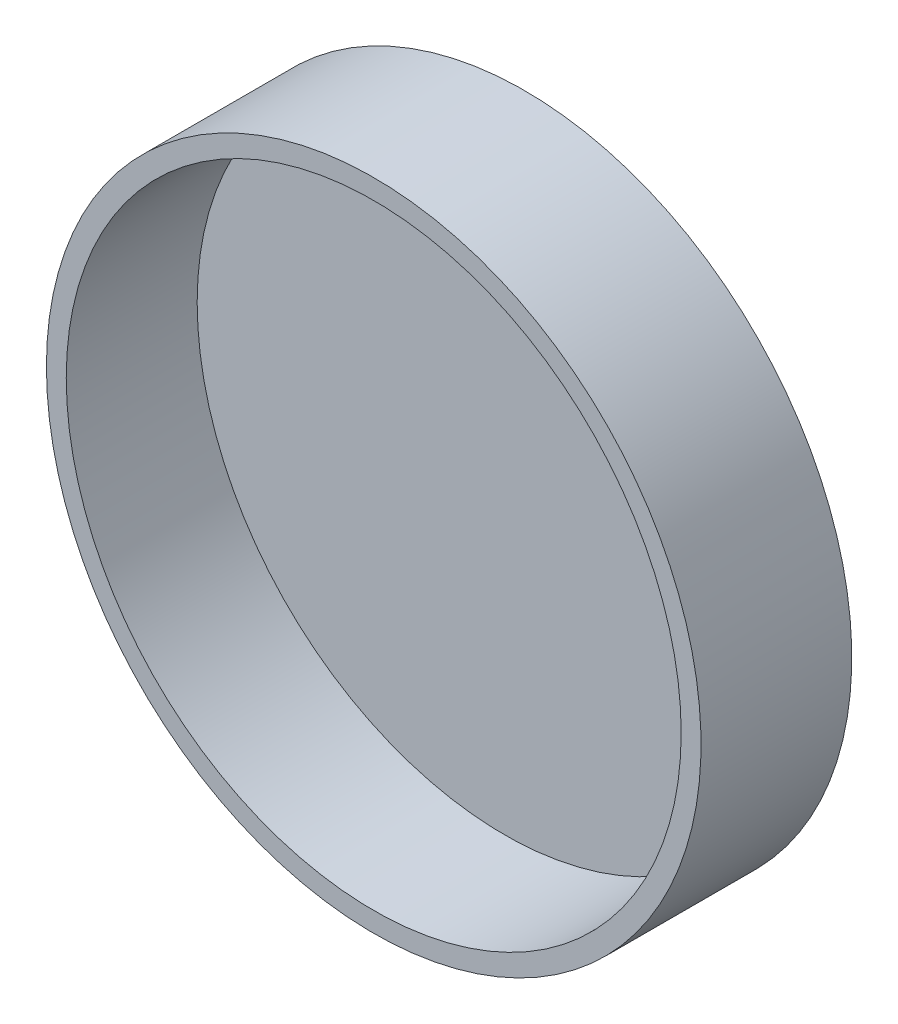
ISO-10303-21;
HEADER;
FILE_DESCRIPTION(('STEP AP214'),'2;1');
FILE_NAME('part.step','',(''),(''),'','','');
FILE_SCHEMA(('AUTOMOTIVE_DESIGN { 1 0 10303 214 1 1 1 1 }'));
ENDSEC;
DATA;
#1=APPLICATION_CONTEXT('core data for automotive mechanical design processes');
#2=APPLICATION_PROTOCOL_DEFINITION('international standard','automotive_design',2000,#1);
#3=PRODUCT_CONTEXT('',#1,'mechanical');
#4=PRODUCT('Part','Part','',(#3));
#5=PRODUCT_RELATED_PRODUCT_CATEGORY('part','',(#4));
#6=PRODUCT_DEFINITION_FORMATION('','',#4);
#7=PRODUCT_DEFINITION_CONTEXT('part definition',#1,'design');
#8=PRODUCT_DEFINITION('design','',#6,#7);
#9=PRODUCT_DEFINITION_SHAPE('','',#8);
#10=(LENGTH_UNIT() NAMED_UNIT(*) SI_UNIT(.MILLI.,.METRE.));
#11=(NAMED_UNIT(*) PLANE_ANGLE_UNIT() SI_UNIT($,.RADIAN.));
#12=(NAMED_UNIT(*) SI_UNIT($,.STERADIAN.) SOLID_ANGLE_UNIT());
#13=UNCERTAINTY_MEASURE_WITH_UNIT(LENGTH_MEASURE(1.E-05),#10,'distance_accuracy_value','');
#14=(GEOMETRIC_REPRESENTATION_CONTEXT(3) GLOBAL_UNCERTAINTY_ASSIGNED_CONTEXT((#13)) GLOBAL_UNIT_ASSIGNED_CONTEXT((#10,
#11,#12)) REPRESENTATION_CONTEXT('',''));
#15=CARTESIAN_POINT('',(0.,0.,0.));
#16=DIRECTION('',(0.,0.,1.));
#17=DIRECTION('',(1.,0.,0.));
#18=AXIS2_PLACEMENT_3D('',#15,#16,#17);
#19=CARTESIAN_POINT('',(0.,0.,7.6));
#20=DIRECTION('',(0.,0.,-1.));
#21=DIRECTION('',(-1.,0.,0.));
#22=AXIS2_PLACEMENT_3D('',#19,#20,#21);
#23=CYLINDRICAL_SURFACE('',#22,16.5);
#24=CARTESIAN_POINT('',(0.,0.,7.6));
#25=DIRECTION('',(0.,0.,1.));
#26=DIRECTION('',(1.,0.,0.));
#27=AXIS2_PLACEMENT_3D('',#24,#25,#26);
#28=CIRCLE('',#27,16.5);
#29=CARTESIAN_POINT('',(-16.5,0.,7.6));
#30=VERTEX_POINT('',#29);
#31=EDGE_CURVE('E10',#30,#30,#28,.T.);
#32=CARTESIAN_POINT('',(0.,0.,0.));
#33=DIRECTION('',(0.,0.,1.));
#34=DIRECTION('',(1.,0.,0.));
#35=AXIS2_PLACEMENT_3D('',#32,#33,#34);
#36=CIRCLE('',#35,16.5);
#37=CARTESIAN_POINT('',(-16.5,0.,0.));
#38=VERTEX_POINT('',#37);
#39=EDGE_CURVE('E34',#38,#38,#36,.T.);
#40=CARTESIAN_POINT('',(-16.5,0.,7.6));
#41=CARTESIAN_POINT('',(-16.5,0.,7.52083333333333));
#42=CARTESIAN_POINT('',(-16.5,0.,7.44166666666667));
#43=CARTESIAN_POINT('',(-16.5,0.,7.28333333333333));
#44=CARTESIAN_POINT('',(-16.5,0.,7.20416666666667));
#45=CARTESIAN_POINT('',(-16.5,0.,7.04583333333333));
#46=CARTESIAN_POINT('',(-16.5,0.,6.96666666666667));
#47=CARTESIAN_POINT('',(-16.5,0.,6.80833333333333));
#48=CARTESIAN_POINT('',(-16.5,0.,6.72916666666667));
#49=CARTESIAN_POINT('',(-16.5,0.,6.57083333333333));
#50=CARTESIAN_POINT('',(-16.5,0.,6.49166666666667));
#51=CARTESIAN_POINT('',(-16.5,0.,6.33333333333333));
#52=CARTESIAN_POINT('',(-16.5,0.,6.25416666666667));
#53=CARTESIAN_POINT('',(-16.5,0.,6.09583333333333));
#54=CARTESIAN_POINT('',(-16.5,0.,6.01666666666667));
#55=CARTESIAN_POINT('',(-16.5,0.,5.85833333333333));
#56=CARTESIAN_POINT('',(-16.5,0.,5.77916666666667));
#57=CARTESIAN_POINT('',(-16.5,0.,5.62083333333333));
#58=CARTESIAN_POINT('',(-16.5,0.,5.54166666666667));
#59=CARTESIAN_POINT('',(-16.5,0.,5.38333333333333));
#60=CARTESIAN_POINT('',(-16.5,0.,5.30416666666667));
#61=CARTESIAN_POINT('',(-16.5,0.,5.14583333333333));
#62=CARTESIAN_POINT('',(-16.5,0.,5.06666666666667));
#63=CARTESIAN_POINT('',(-16.5,0.,4.90833333333333));
#64=CARTESIAN_POINT('',(-16.5,0.,4.82916666666667));
#65=CARTESIAN_POINT('',(-16.5,0.,4.67083333333333));
#66=CARTESIAN_POINT('',(-16.5,0.,4.59166666666667));
#67=CARTESIAN_POINT('',(-16.5,0.,4.43333333333333));
#68=CARTESIAN_POINT('',(-16.5,0.,4.35416666666667));
#69=CARTESIAN_POINT('',(-16.5,0.,4.19583333333333));
#70=CARTESIAN_POINT('',(-16.5,0.,4.11666666666667));
#71=CARTESIAN_POINT('',(-16.5,0.,3.95833333333333));
#72=CARTESIAN_POINT('',(-16.5,0.,3.87916666666667));
#73=CARTESIAN_POINT('',(-16.5,0.,3.72083333333333));
#74=CARTESIAN_POINT('',(-16.5,0.,3.64166666666667));
#75=CARTESIAN_POINT('',(-16.5,0.,3.48333333333333));
#76=CARTESIAN_POINT('',(-16.5,0.,3.40416666666667));
#77=CARTESIAN_POINT('',(-16.5,0.,3.24583333333333));
#78=CARTESIAN_POINT('',(-16.5,0.,3.16666666666667));
#79=CARTESIAN_POINT('',(-16.5,0.,3.00833333333333));
#80=CARTESIAN_POINT('',(-16.5,0.,2.92916666666667));
#81=CARTESIAN_POINT('',(-16.5,0.,2.77083333333333));
#82=CARTESIAN_POINT('',(-16.5,0.,2.69166666666667));
#83=CARTESIAN_POINT('',(-16.5,0.,2.53333333333333));
#84=CARTESIAN_POINT('',(-16.5,0.,2.45416666666667));
#85=CARTESIAN_POINT('',(-16.5,0.,2.29583333333333));
#86=CARTESIAN_POINT('',(-16.5,0.,2.21666666666667));
#87=CARTESIAN_POINT('',(-16.5,0.,2.05833333333333));
#88=CARTESIAN_POINT('',(-16.5,0.,1.97916666666667));
#89=CARTESIAN_POINT('',(-16.5,0.,1.82083333333333));
#90=CARTESIAN_POINT('',(-16.5,0.,1.74166666666667));
#91=CARTESIAN_POINT('',(-16.5,0.,1.58333333333333));
#92=CARTESIAN_POINT('',(-16.5,0.,1.50416666666667));
#93=CARTESIAN_POINT('',(-16.5,0.,1.34583333333333));
#94=CARTESIAN_POINT('',(-16.5,0.,1.26666666666667));
#95=CARTESIAN_POINT('',(-16.5,0.,1.10833333333333));
#96=CARTESIAN_POINT('',(-16.5,0.,1.02916666666667));
#97=CARTESIAN_POINT('',(-16.5,0.,0.870833333333333));
#98=CARTESIAN_POINT('',(-16.5,0.,0.791666666666667));
#99=CARTESIAN_POINT('',(-16.5,0.,0.633333333333333));
#100=CARTESIAN_POINT('',(-16.5,0.,0.554166666666666));
#101=CARTESIAN_POINT('',(-16.5,0.,0.395833333333333));
#102=CARTESIAN_POINT('',(-16.5,0.,0.316666666666667));
#103=CARTESIAN_POINT('',(-16.5,0.,0.158333333333333));
#104=CARTESIAN_POINT('',(-16.5,0.,0.0791666666666665));
#105=CARTESIAN_POINT('',(-16.5,0.,0.));
#106=B_SPLINE_CURVE_WITH_KNOTS('',3,(#40,#41,#42,#43,#44,#45,#46,#47,#48,#49,#50,#51,#52,#53,
#54,#55,#56,#57,#58,#59,#60,#61,#62,#63,#64,#65,#66,#67,#68,#69,#70,#71,#72,#73,#74,#75,#76,#77,
#78,#79,#80,#81,#82,#83,#84,#85,#86,#87,#88,#89,#90,#91,#92,#93,#94,#95,#96,#97,#98,#99,#100,
#101,#102,#103,#104,#105),.UNSPECIFIED.,.F.,.F.,(4,2,2,2,2,2,2,2,2,2,2,2,2,2,2,2,2,2,2,2,2,2,2,
2,2,2,2,2,2,2,2,2,4),(0.,0.2375,0.475,0.7125,0.95,1.1875,1.425,1.6625,1.9,2.1375,2.375,2.6125,
2.85,3.0875,3.325,3.5625,3.8,4.0375,4.275,4.5125,4.75,4.9875,5.225,5.4625,5.7,5.9375,6.175,
6.4125,6.65,6.8875,7.125,7.3625,7.6),.UNSPECIFIED.);
#107=EDGE_CURVE('BSEAM31',#30,#38,#106,.T.);
#108=ORIENTED_EDGE('',*,*,#31,.F.);
#109=ORIENTED_EDGE('',*,*,#39,.T.);
#110=ORIENTED_EDGE('',*,*,#107,.T.);
#111=ORIENTED_EDGE('',*,*,#107,.F.);
#112=EDGE_LOOP('',(#108,#110,#109,#111));
#113=FACE_BOUND('',#112,.T.);
#114=ADVANCED_FACE('F31',(#113),#23,.T.);
#115=CARTESIAN_POINT('',(0.,0.,7.6));
#116=DIRECTION('',(0.,0.,1.));
#117=DIRECTION('',(1.,0.,0.));
#118=AXIS2_PLACEMENT_3D('',#115,#116,#117);
#119=PLANE('',#118);
#120=CARTESIAN_POINT('',(0.,0.,7.6));
#121=DIRECTION('',(0.,0.,1.));
#122=DIRECTION('',(1.,0.,0.));
#123=AXIS2_PLACEMENT_3D('',#120,#121,#122);
#124=CIRCLE('',#123,15.5);
#125=CARTESIAN_POINT('',(-15.5,0.,7.6));
#126=VERTEX_POINT('',#125);
#127=EDGE_CURVE('E41',#126,#126,#124,.T.);
#128=ORIENTED_EDGE('',*,*,#127,.F.);
#129=EDGE_LOOP('',(#128));
#130=FACE_BOUND('',#129,.T.);
#131=ORIENTED_EDGE('',*,*,#31,.T.);
#132=EDGE_LOOP('',(#131));
#133=FACE_BOUND('',#132,.T.);
#134=ADVANCED_FACE('F61',(#130,#133),#119,.T.);
#135=CARTESIAN_POINT('',(0.,0.,0.));
#136=DIRECTION('',(0.,0.,1.));
#137=DIRECTION('',(1.,0.,0.));
#138=AXIS2_PLACEMENT_3D('',#135,#136,#137);
#139=PLANE('',#138);
#140=ORIENTED_EDGE('',*,*,#39,.F.);
#141=EDGE_LOOP('',(#140));
#142=FACE_BOUND('',#141,.T.);
#143=ADVANCED_FACE('F53',(#142),#139,.F.);
#144=CARTESIAN_POINT('',(0.,0.,7.6));
#145=DIRECTION('',(0.,0.,-1.));
#146=DIRECTION('',(-1.,0.,0.));
#147=AXIS2_PLACEMENT_3D('',#144,#145,#146);
#148=CYLINDRICAL_SURFACE('',#147,15.5);
#149=CARTESIAN_POINT('',(0.,0.,1.));
#150=DIRECTION('',(0.,0.,1.));
#151=DIRECTION('',(1.,0.,0.));
#152=AXIS2_PLACEMENT_3D('',#149,#150,#151);
#153=CIRCLE('',#152,15.5);
#154=CARTESIAN_POINT('',(-15.5,0.,0.999999999999999));
#155=VERTEX_POINT('',#154);
#156=EDGE_CURVE('E45',#155,#155,#153,.T.);
#157=CARTESIAN_POINT('',(-15.5,0.,7.6));
#158=CARTESIAN_POINT('',(-15.5,0.,7.53125));
#159=CARTESIAN_POINT('',(-15.5,0.,7.4625));
#160=CARTESIAN_POINT('',(-15.5,0.,7.325));
#161=CARTESIAN_POINT('',(-15.5,0.,7.25625));
#162=CARTESIAN_POINT('',(-15.5,0.,7.11875));
#163=CARTESIAN_POINT('',(-15.5,0.,7.05));
#164=CARTESIAN_POINT('',(-15.5,0.,6.9125));
#165=CARTESIAN_POINT('',(-15.5,0.,6.84375));
#166=CARTESIAN_POINT('',(-15.5,0.,6.70625));
#167=CARTESIAN_POINT('',(-15.5,0.,6.6375));
#168=CARTESIAN_POINT('',(-15.5,0.,6.5));
#169=CARTESIAN_POINT('',(-15.5,0.,6.43125));
#170=CARTESIAN_POINT('',(-15.5,0.,6.29375));
#171=CARTESIAN_POINT('',(-15.5,0.,6.225));
#172=CARTESIAN_POINT('',(-15.5,0.,6.0875));
#173=CARTESIAN_POINT('',(-15.5,0.,6.01875));
#174=CARTESIAN_POINT('',(-15.5,0.,5.88125));
#175=CARTESIAN_POINT('',(-15.5,0.,5.8125));
#176=CARTESIAN_POINT('',(-15.5,0.,5.675));
#177=CARTESIAN_POINT('',(-15.5,0.,5.60625));
#178=CARTESIAN_POINT('',(-15.5,0.,5.46875));
#179=CARTESIAN_POINT('',(-15.5,0.,5.4));
#180=CARTESIAN_POINT('',(-15.5,0.,5.2625));
#181=CARTESIAN_POINT('',(-15.5,0.,5.19375));
#182=CARTESIAN_POINT('',(-15.5,0.,5.05625));
#183=CARTESIAN_POINT('',(-15.5,0.,4.9875));
#184=CARTESIAN_POINT('',(-15.5,0.,4.85));
#185=CARTESIAN_POINT('',(-15.5,0.,4.78125));
#186=CARTESIAN_POINT('',(-15.5,0.,4.64375));
#187=CARTESIAN_POINT('',(-15.5,0.,4.575));
#188=CARTESIAN_POINT('',(-15.5,0.,4.4375));
#189=CARTESIAN_POINT('',(-15.5,0.,4.36875));
#190=CARTESIAN_POINT('',(-15.5,0.,4.23125));
#191=CARTESIAN_POINT('',(-15.5,0.,4.1625));
#192=CARTESIAN_POINT('',(-15.5,0.,4.025));
#193=CARTESIAN_POINT('',(-15.5,0.,3.95625));
#194=CARTESIAN_POINT('',(-15.5,0.,3.81875));
#195=CARTESIAN_POINT('',(-15.5,0.,3.75));
#196=CARTESIAN_POINT('',(-15.5,0.,3.6125));
#197=CARTESIAN_POINT('',(-15.5,0.,3.54375));
#198=CARTESIAN_POINT('',(-15.5,0.,3.40625));
#199=CARTESIAN_POINT('',(-15.5,0.,3.3375));
#200=CARTESIAN_POINT('',(-15.5,0.,3.2));
#201=CARTESIAN_POINT('',(-15.5,0.,3.13125));
#202=CARTESIAN_POINT('',(-15.5,0.,2.99375));
#203=CARTESIAN_POINT('',(-15.5,0.,2.925));
#204=CARTESIAN_POINT('',(-15.5,0.,2.7875));
#205=CARTESIAN_POINT('',(-15.5,0.,2.71875));
#206=CARTESIAN_POINT('',(-15.5,0.,2.58125));
#207=CARTESIAN_POINT('',(-15.5,0.,2.5125));
#208=CARTESIAN_POINT('',(-15.5,0.,2.375));
#209=CARTESIAN_POINT('',(-15.5,0.,2.30625));
#210=CARTESIAN_POINT('',(-15.5,0.,2.16875));
#211=CARTESIAN_POINT('',(-15.5,0.,2.1));
#212=CARTESIAN_POINT('',(-15.5,0.,1.9625));
#213=CARTESIAN_POINT('',(-15.5,0.,1.89375));
#214=CARTESIAN_POINT('',(-15.5,0.,1.75625));
#215=CARTESIAN_POINT('',(-15.5,0.,1.6875));
#216=CARTESIAN_POINT('',(-15.5,0.,1.55));
#217=CARTESIAN_POINT('',(-15.5,0.,1.48125));
#218=CARTESIAN_POINT('',(-15.5,0.,1.34375));
#219=CARTESIAN_POINT('',(-15.5,0.,1.275));
#220=CARTESIAN_POINT('',(-15.5,0.,1.1375));
#221=CARTESIAN_POINT('',(-15.5,0.,1.06875));
#222=CARTESIAN_POINT('',(-15.5,0.,0.999999999999999));
#223=B_SPLINE_CURVE_WITH_KNOTS('',3,(#157,#158,#159,#160,#161,#162,#163,#164,#165,#166,#167,
#168,#169,#170,#171,#172,#173,#174,#175,#176,#177,#178,#179,#180,#181,#182,#183,#184,#185,#186,
#187,#188,#189,#190,#191,#192,#193,#194,#195,#196,#197,#198,#199,#200,#201,#202,#203,#204,#205,
#206,#207,#208,#209,#210,#211,#212,#213,#214,#215,#216,#217,#218,#219,#220,#221,#222),
.UNSPECIFIED.,.F.,.F.,(4,2,2,2,2,2,2,2,2,2,2,2,2,2,2,2,2,2,2,2,2,2,2,2,2,2,2,2,2,2,2,2,4),(0.,
0.206250000000001,0.412500000000001,0.61875,0.825,1.03125,1.2375,1.44375,1.65,1.85625,2.0625,
2.26875,2.475,2.68125,2.8875,3.09375,3.3,3.50625,3.7125,3.91875,4.125,4.33125,4.5375,4.74375,
4.95,5.15625,5.3625,5.56875,5.775,5.98125,6.1875,6.39375,6.6),.UNSPECIFIED.);
#224=EDGE_CURVE('BSEAM51',#126,#155,#223,.T.);
#225=ORIENTED_EDGE('',*,*,#127,.T.);
#226=ORIENTED_EDGE('',*,*,#156,.F.);
#227=ORIENTED_EDGE('',*,*,#224,.T.);
#228=ORIENTED_EDGE('',*,*,#224,.F.);
#229=EDGE_LOOP('',(#225,#227,#226,#228));
#230=FACE_BOUND('',#229,.T.);
#231=ADVANCED_FACE('F51',(#230),#148,.F.);
#232=CARTESIAN_POINT('',(0.,0.,1.));
#233=DIRECTION('',(0.,0.,1.));
#234=DIRECTION('',(1.,0.,0.));
#235=AXIS2_PLACEMENT_3D('',#232,#233,#234);
#236=PLANE('',#235);
#237=ORIENTED_EDGE('',*,*,#156,.T.);
#238=EDGE_LOOP('',(#237));
#239=FACE_BOUND('',#238,.T.);
#240=ADVANCED_FACE('F49',(#239),#236,.T.);
#241=CLOSED_SHELL('',(#114,#134,#143,#231,#240));
#242=MANIFOLD_SOLID_BREP('B2',#241);
#243=ADVANCED_BREP_SHAPE_REPRESENTATION('',(#18,#242),#14);
#244=SHAPE_DEFINITION_REPRESENTATION(#9,#243);
ENDSEC;
END-ISO-10303-21;
